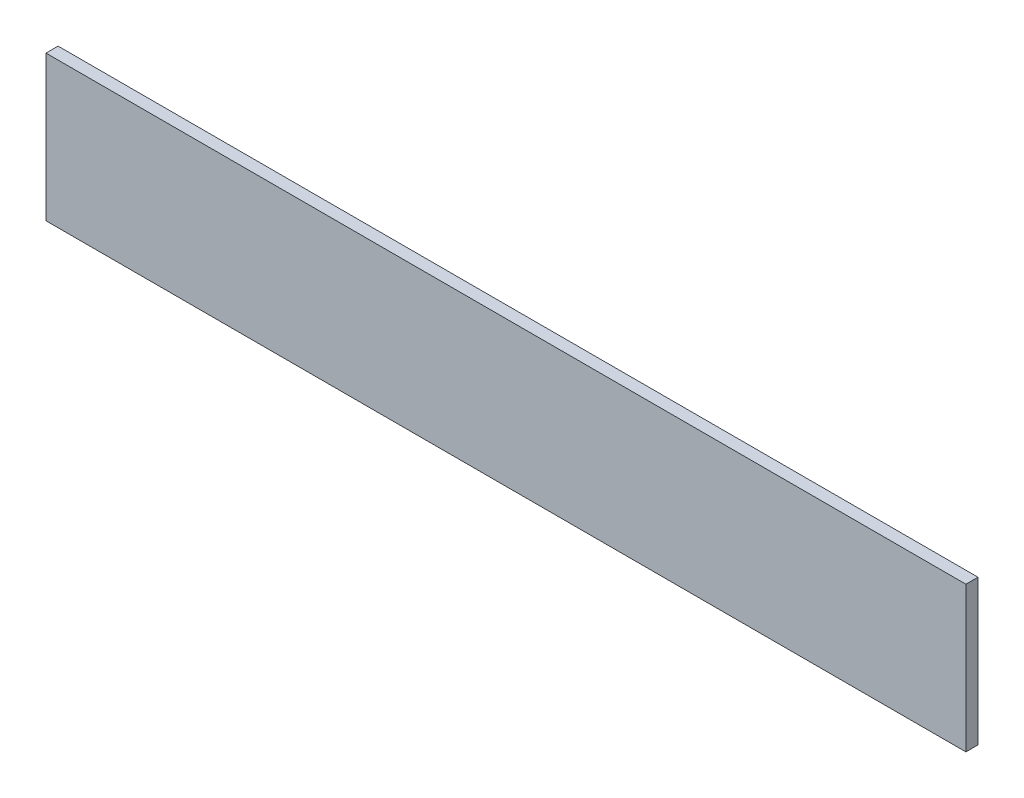
ISO-10303-21;
HEADER;
FILE_DESCRIPTION(('STEP AP214'),'2;1');
FILE_NAME('part.step','',(''),(''),'','','');
FILE_SCHEMA(('AUTOMOTIVE_DESIGN { 1 0 10303 214 1 1 1 1 }'));
ENDSEC;
DATA;
#1=APPLICATION_CONTEXT('core data for automotive mechanical design processes');
#2=APPLICATION_PROTOCOL_DEFINITION('international standard','automotive_design',2000,#1);
#3=PRODUCT_CONTEXT('',#1,'mechanical');
#4=PRODUCT('Part','Part','',(#3));
#5=PRODUCT_RELATED_PRODUCT_CATEGORY('part','',(#4));
#6=PRODUCT_DEFINITION_FORMATION('','',#4);
#7=PRODUCT_DEFINITION_CONTEXT('part definition',#1,'design');
#8=PRODUCT_DEFINITION('design','',#6,#7);
#9=PRODUCT_DEFINITION_SHAPE('','',#8);
#10=(LENGTH_UNIT() NAMED_UNIT(*) SI_UNIT(.MILLI.,.METRE.));
#11=(NAMED_UNIT(*) PLANE_ANGLE_UNIT() SI_UNIT($,.RADIAN.));
#12=(NAMED_UNIT(*) SI_UNIT($,.STERADIAN.) SOLID_ANGLE_UNIT());
#13=UNCERTAINTY_MEASURE_WITH_UNIT(LENGTH_MEASURE(1.E-05),#10,'distance_accuracy_value','');
#14=(GEOMETRIC_REPRESENTATION_CONTEXT(3) GLOBAL_UNCERTAINTY_ASSIGNED_CONTEXT((#13)) GLOBAL_UNIT_ASSIGNED_CONTEXT((#10,
#11,#12)) REPRESENTATION_CONTEXT('',''));
#15=CARTESIAN_POINT('',(0.,0.,0.));
#16=DIRECTION('',(0.,0.,1.));
#17=DIRECTION('',(1.,0.,0.));
#18=AXIS2_PLACEMENT_3D('',#15,#16,#17);
#19=CARTESIAN_POINT('',(38.,-46.,25.));
#20=DIRECTION('',(-1.,0.,0.));
#21=DIRECTION('',(0.,0.,1.));
#22=AXIS2_PLACEMENT_3D('',#19,#20,#21);
#23=PLANE('',#22);
#24=DIRECTION('',(0.,1.,0.));
#25=VECTOR('',#24,1.);
#26=CARTESIAN_POINT('',(38.,-46.,24.));
#27=LINE('',#26,#25);
#28=CARTESIAN_POINT('',(38.,-46.,24.));
#29=VERTEX_POINT('',#28);
#30=CARTESIAN_POINT('',(38.,-34.,24.));
#31=VERTEX_POINT('',#30);
#32=EDGE_CURVE('E102',#29,#31,#27,.T.);
#33=ORIENTED_EDGE('',*,*,#32,.T.);
#34=DIRECTION('',(0.,0.,-1.));
#35=VECTOR('',#34,1.);
#36=CARTESIAN_POINT('',(38.,-34.,25.));
#37=LINE('',#36,#35);
#38=CARTESIAN_POINT('',(38.,-34.,25.));
#39=VERTEX_POINT('',#38);
#40=EDGE_CURVE('E11',#39,#31,#37,.T.);
#41=ORIENTED_EDGE('',*,*,#40,.F.);
#42=DIRECTION('',(0.,1.,0.));
#43=VECTOR('',#42,1.);
#44=CARTESIAN_POINT('',(38.,-46.,25.));
#45=LINE('',#44,#43);
#46=CARTESIAN_POINT('',(38.,-46.,25.));
#47=VERTEX_POINT('',#46);
#48=EDGE_CURVE('E90',#47,#39,#45,.T.);
#49=ORIENTED_EDGE('',*,*,#48,.F.);
#50=DIRECTION('',(0.,0.,-1.));
#51=VECTOR('',#50,1.);
#52=CARTESIAN_POINT('',(38.,-46.,25.));
#53=LINE('',#52,#51);
#54=EDGE_CURVE('E98',#47,#29,#53,.T.);
#55=ORIENTED_EDGE('',*,*,#54,.T.);
#56=EDGE_LOOP('',(#33,#41,#49,#55));
#57=FACE_BOUND('',#56,.T.);
#58=ADVANCED_FACE('F39',(#57),#23,.F.);
#59=CARTESIAN_POINT('',(-38.,-34.,25.));
#60=DIRECTION('',(0.,-1.,0.));
#61=DIRECTION('',(0.,0.,-1.));
#62=AXIS2_PLACEMENT_3D('',#59,#60,#61);
#63=PLANE('',#62);
#64=DIRECTION('',(-1.,0.,0.));
#65=VECTOR('',#64,1.);
#66=CARTESIAN_POINT('',(-38.,-34.,24.));
#67=LINE('',#66,#65);
#68=CARTESIAN_POINT('',(-38.,-34.,24.));
#69=VERTEX_POINT('',#68);
#70=EDGE_CURVE('E94',#31,#69,#67,.T.);
#71=ORIENTED_EDGE('',*,*,#70,.T.);
#72=DIRECTION('',(0.,0.,-1.));
#73=VECTOR('',#72,1.);
#74=CARTESIAN_POINT('',(-38.,-34.,25.));
#75=LINE('',#74,#73);
#76=CARTESIAN_POINT('',(-38.,-34.,25.));
#77=VERTEX_POINT('',#76);
#78=EDGE_CURVE('E47',#77,#69,#75,.T.);
#79=ORIENTED_EDGE('',*,*,#78,.F.);
#80=DIRECTION('',(-1.,0.,0.));
#81=VECTOR('',#80,1.);
#82=CARTESIAN_POINT('',(-38.,-34.,25.));
#83=LINE('',#82,#81);
#84=EDGE_CURVE('E85',#39,#77,#83,.T.);
#85=ORIENTED_EDGE('',*,*,#84,.F.);
#86=ORIENTED_EDGE('',*,*,#40,.T.);
#87=EDGE_LOOP('',(#71,#79,#85,#86));
#88=FACE_BOUND('',#87,.T.);
#89=ADVANCED_FACE('F93',(#88),#63,.F.);
#90=CARTESIAN_POINT('',(-38.,-46.,25.));
#91=DIRECTION('',(1.,0.,0.));
#92=DIRECTION('',(0.,0.,-1.));
#93=AXIS2_PLACEMENT_3D('',#90,#91,#92);
#94=PLANE('',#93);
#95=DIRECTION('',(0.,-1.,0.));
#96=VECTOR('',#95,1.);
#97=CARTESIAN_POINT('',(-38.,-46.,24.));
#98=LINE('',#97,#96);
#99=CARTESIAN_POINT('',(-38.,-46.,24.));
#100=VERTEX_POINT('',#99);
#101=EDGE_CURVE('E72',#69,#100,#98,.T.);
#102=ORIENTED_EDGE('',*,*,#101,.T.);
#103=DIRECTION('',(0.,0.,-1.));
#104=VECTOR('',#103,1.);
#105=CARTESIAN_POINT('',(-38.,-46.,25.));
#106=LINE('',#105,#104);
#107=CARTESIAN_POINT('',(-38.,-46.,25.));
#108=VERTEX_POINT('',#107);
#109=EDGE_CURVE('E95',#108,#100,#106,.T.);
#110=ORIENTED_EDGE('',*,*,#109,.F.);
#111=DIRECTION('',(0.,-1.,0.));
#112=VECTOR('',#111,1.);
#113=CARTESIAN_POINT('',(-38.,-46.,25.));
#114=LINE('',#113,#112);
#115=EDGE_CURVE('E88',#77,#108,#114,.T.);
#116=ORIENTED_EDGE('',*,*,#115,.F.);
#117=ORIENTED_EDGE('',*,*,#78,.T.);
#118=EDGE_LOOP('',(#102,#110,#116,#117));
#119=FACE_BOUND('',#118,.T.);
#120=ADVANCED_FACE('F96',(#119),#94,.F.);
#121=CARTESIAN_POINT('',(-38.,-46.,25.));
#122=DIRECTION('',(0.,1.,0.));
#123=DIRECTION('',(0.,0.,1.));
#124=AXIS2_PLACEMENT_3D('',#121,#122,#123);
#125=PLANE('',#124);
#126=DIRECTION('',(1.,0.,0.));
#127=VECTOR('',#126,1.);
#128=CARTESIAN_POINT('',(-38.,-46.,24.));
#129=LINE('',#128,#127);
#130=EDGE_CURVE('E78',#100,#29,#129,.T.);
#131=ORIENTED_EDGE('',*,*,#130,.T.);
#132=ORIENTED_EDGE('',*,*,#54,.F.);
#133=DIRECTION('',(1.,0.,0.));
#134=VECTOR('',#133,1.);
#135=CARTESIAN_POINT('',(-38.,-46.,25.));
#136=LINE('',#135,#134);
#137=EDGE_CURVE('E55',#108,#47,#136,.T.);
#138=ORIENTED_EDGE('',*,*,#137,.F.);
#139=ORIENTED_EDGE('',*,*,#109,.T.);
#140=EDGE_LOOP('',(#131,#132,#138,#139));
#141=FACE_BOUND('',#140,.T.);
#142=ADVANCED_FACE('F109',(#141),#125,.F.);
#143=CARTESIAN_POINT('',(0.,0.,25.));
#144=DIRECTION('',(0.,0.,-1.));
#145=DIRECTION('',(-1.,0.,0.));
#146=AXIS2_PLACEMENT_3D('',#143,#144,#145);
#147=PLANE('',#146);
#148=ORIENTED_EDGE('',*,*,#48,.T.);
#149=ORIENTED_EDGE('',*,*,#84,.T.);
#150=ORIENTED_EDGE('',*,*,#115,.T.);
#151=ORIENTED_EDGE('',*,*,#137,.T.);
#152=EDGE_LOOP('',(#148,#149,#150,#151));
#153=FACE_BOUND('',#152,.T.);
#154=ADVANCED_FACE('F86',(#153),#147,.F.);
#155=CARTESIAN_POINT('',(0.,0.,24.));
#156=DIRECTION('',(0.,0.,-1.));
#157=DIRECTION('',(-1.,0.,0.));
#158=AXIS2_PLACEMENT_3D('',#155,#156,#157);
#159=PLANE('',#158);
#160=ORIENTED_EDGE('',*,*,#32,.F.);
#161=ORIENTED_EDGE('',*,*,#130,.F.);
#162=ORIENTED_EDGE('',*,*,#101,.F.);
#163=ORIENTED_EDGE('',*,*,#70,.F.);
#164=EDGE_LOOP('',(#160,#161,#162,#163));
#165=FACE_BOUND('',#164,.T.);
#166=ADVANCED_FACE('F112',(#165),#159,.T.);
#167=CLOSED_SHELL('',(#58,#89,#120,#142,#154,#166));
#168=MANIFOLD_SOLID_BREP('B2',#167);
#169=ADVANCED_BREP_SHAPE_REPRESENTATION('',(#18,#168),#14);
#170=SHAPE_DEFINITION_REPRESENTATION(#9,#169);
ENDSEC;
END-ISO-10303-21;
